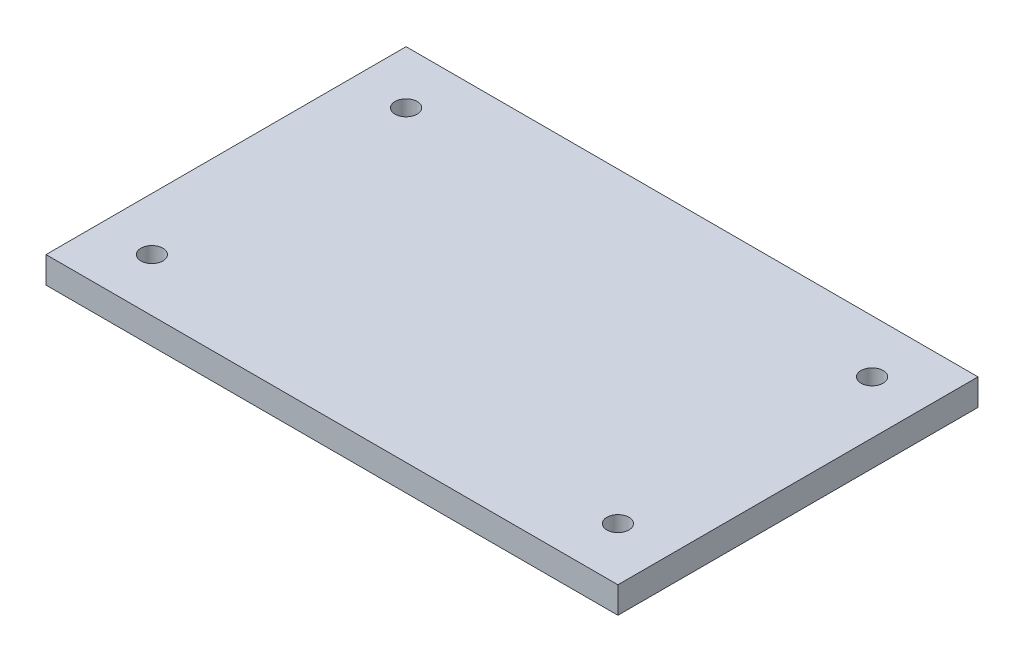
ISO-10303-21;
HEADER;
FILE_DESCRIPTION(('STEP AP214'),'2;1');
FILE_NAME('part.step','',(''),(''),'','','');
FILE_SCHEMA(('AUTOMOTIVE_DESIGN { 1 0 10303 214 1 1 1 1 }'));
ENDSEC;
DATA;
#1=APPLICATION_CONTEXT('core data for automotive mechanical design processes');
#2=APPLICATION_PROTOCOL_DEFINITION('international standard','automotive_design',2000,#1);
#3=PRODUCT_CONTEXT('',#1,'mechanical');
#4=PRODUCT('Part','Part','',(#3));
#5=PRODUCT_RELATED_PRODUCT_CATEGORY('part','',(#4));
#6=PRODUCT_DEFINITION_FORMATION('','',#4);
#7=PRODUCT_DEFINITION_CONTEXT('part definition',#1,'design');
#8=PRODUCT_DEFINITION('design','',#6,#7);
#9=PRODUCT_DEFINITION_SHAPE('','',#8);
#10=(LENGTH_UNIT() NAMED_UNIT(*) SI_UNIT(.MILLI.,.METRE.));
#11=(NAMED_UNIT(*) PLANE_ANGLE_UNIT() SI_UNIT($,.RADIAN.));
#12=(NAMED_UNIT(*) SI_UNIT($,.STERADIAN.) SOLID_ANGLE_UNIT());
#13=UNCERTAINTY_MEASURE_WITH_UNIT(LENGTH_MEASURE(1.E-05),#10,'distance_accuracy_value','');
#14=(GEOMETRIC_REPRESENTATION_CONTEXT(3) GLOBAL_UNCERTAINTY_ASSIGNED_CONTEXT((#13)) GLOBAL_UNIT_ASSIGNED_CONTEXT((#10,
#11,#12)) REPRESENTATION_CONTEXT('',''));
#15=CARTESIAN_POINT('',(0.,0.,0.));
#16=DIRECTION('',(0.,0.,1.));
#17=DIRECTION('',(1.,0.,0.));
#18=AXIS2_PLACEMENT_3D('',#15,#16,#17);
#19=CARTESIAN_POINT('',(7.62,6.35,-7.62));
#20=DIRECTION('',(1.,0.,0.));
#21=DIRECTION('',(0.,0.,-1.));
#22=AXIS2_PLACEMENT_3D('',#19,#20,#21);
#23=PLANE('',#22);
#24=DIRECTION('',(0.,0.,1.));
#25=VECTOR('',#24,1.);
#26=CARTESIAN_POINT('',(7.62,0.,-7.62));
#27=LINE('',#26,#25);
#28=CARTESIAN_POINT('',(7.62,0.,-93.98));
#29=VERTEX_POINT('',#28);
#30=CARTESIAN_POINT('',(7.62,0.,-7.62));
#31=VERTEX_POINT('',#30);
#32=EDGE_CURVE('E96',#29,#31,#27,.T.);
#33=ORIENTED_EDGE('',*,*,#32,.T.);
#34=DIRECTION('',(0.,-1.,0.));
#35=VECTOR('',#34,1.);
#36=CARTESIAN_POINT('',(7.62,6.35,-7.62));
#37=LINE('',#36,#35);
#38=CARTESIAN_POINT('',(7.62,6.35,-7.62));
#39=VERTEX_POINT('',#38);
#40=EDGE_CURVE('E11',#39,#31,#37,.T.);
#41=ORIENTED_EDGE('',*,*,#40,.F.);
#42=DIRECTION('',(0.,0.,1.));
#43=VECTOR('',#42,1.);
#44=CARTESIAN_POINT('',(7.62,6.35,-7.62));
#45=LINE('',#44,#43);
#46=CARTESIAN_POINT('',(7.62,6.35,-93.98));
#47=VERTEX_POINT('',#46);
#48=EDGE_CURVE('E84',#47,#39,#45,.T.);
#49=ORIENTED_EDGE('',*,*,#48,.F.);
#50=DIRECTION('',(0.,-1.,0.));
#51=VECTOR('',#50,1.);
#52=CARTESIAN_POINT('',(7.62,6.35,-93.98));
#53=LINE('',#52,#51);
#54=EDGE_CURVE('E92',#47,#29,#53,.T.);
#55=ORIENTED_EDGE('',*,*,#54,.T.);
#56=EDGE_LOOP('',(#33,#41,#49,#55));
#57=FACE_BOUND('',#56,.T.);
#58=ADVANCED_FACE('F33',(#57),#23,.F.);
#59=CARTESIAN_POINT('',(7.62,6.35,-7.62));
#60=DIRECTION('',(0.,0.,-1.));
#61=DIRECTION('',(-1.,0.,0.));
#62=AXIS2_PLACEMENT_3D('',#59,#60,#61);
#63=PLANE('',#62);
#64=DIRECTION('',(1.,0.,0.));
#65=VECTOR('',#64,1.);
#66=CARTESIAN_POINT('',(7.62,0.,-7.62));
#67=LINE('',#66,#65);
#68=CARTESIAN_POINT('',(144.78,0.,-7.62));
#69=VERTEX_POINT('',#68);
#70=EDGE_CURVE('E88',#31,#69,#67,.T.);
#71=ORIENTED_EDGE('',*,*,#70,.T.);
#72=DIRECTION('',(0.,-1.,0.));
#73=VECTOR('',#72,1.);
#74=CARTESIAN_POINT('',(144.78,6.35,-7.62));
#75=LINE('',#74,#73);
#76=CARTESIAN_POINT('',(144.78,6.35,-7.62));
#77=VERTEX_POINT('',#76);
#78=EDGE_CURVE('E41',#77,#69,#75,.T.);
#79=ORIENTED_EDGE('',*,*,#78,.F.);
#80=DIRECTION('',(1.,0.,0.));
#81=VECTOR('',#80,1.);
#82=CARTESIAN_POINT('',(7.62,6.35,-7.62));
#83=LINE('',#82,#81);
#84=EDGE_CURVE('E79',#39,#77,#83,.T.);
#85=ORIENTED_EDGE('',*,*,#84,.F.);
#86=ORIENTED_EDGE('',*,*,#40,.T.);
#87=EDGE_LOOP('',(#71,#79,#85,#86));
#88=FACE_BOUND('',#87,.T.);
#89=ADVANCED_FACE('F87',(#88),#63,.F.);
#90=CARTESIAN_POINT('',(144.78,6.35,-7.62));
#91=DIRECTION('',(-1.,0.,0.));
#92=DIRECTION('',(0.,0.,1.));
#93=AXIS2_PLACEMENT_3D('',#90,#91,#92);
#94=PLANE('',#93);
#95=DIRECTION('',(0.,0.,-1.));
#96=VECTOR('',#95,1.);
#97=CARTESIAN_POINT('',(144.78,0.,-7.62));
#98=LINE('',#97,#96);
#99=CARTESIAN_POINT('',(144.78,0.,-93.98));
#100=VERTEX_POINT('',#99);
#101=EDGE_CURVE('E66',#69,#100,#98,.T.);
#102=ORIENTED_EDGE('',*,*,#101,.T.);
#103=DIRECTION('',(0.,-1.,0.));
#104=VECTOR('',#103,1.);
#105=CARTESIAN_POINT('',(144.78,6.35,-93.98));
#106=LINE('',#105,#104);
#107=CARTESIAN_POINT('',(144.78,6.35,-93.98));
#108=VERTEX_POINT('',#107);
#109=EDGE_CURVE('E89',#108,#100,#106,.T.);
#110=ORIENTED_EDGE('',*,*,#109,.F.);
#111=DIRECTION('',(0.,0.,-1.));
#112=VECTOR('',#111,1.);
#113=CARTESIAN_POINT('',(144.78,6.35,-7.62));
#114=LINE('',#113,#112);
#115=EDGE_CURVE('E82',#77,#108,#114,.T.);
#116=ORIENTED_EDGE('',*,*,#115,.F.);
#117=ORIENTED_EDGE('',*,*,#78,.T.);
#118=EDGE_LOOP('',(#102,#110,#116,#117));
#119=FACE_BOUND('',#118,.T.);
#120=ADVANCED_FACE('F90',(#119),#94,.F.);
#121=CARTESIAN_POINT('',(7.62,6.35,-93.98));
#122=DIRECTION('',(0.,0.,1.));
#123=DIRECTION('',(1.,0.,0.));
#124=AXIS2_PLACEMENT_3D('',#121,#122,#123);
#125=PLANE('',#124);
#126=DIRECTION('',(-1.,0.,0.));
#127=VECTOR('',#126,1.);
#128=CARTESIAN_POINT('',(7.62,0.,-93.98));
#129=LINE('',#128,#127);
#130=EDGE_CURVE('E72',#100,#29,#129,.T.);
#131=ORIENTED_EDGE('',*,*,#130,.T.);
#132=ORIENTED_EDGE('',*,*,#54,.F.);
#133=DIRECTION('',(-1.,0.,0.));
#134=VECTOR('',#133,1.);
#135=CARTESIAN_POINT('',(7.62,6.35,-93.98));
#136=LINE('',#135,#134);
#137=EDGE_CURVE('E49',#108,#47,#136,.T.);
#138=ORIENTED_EDGE('',*,*,#137,.F.);
#139=ORIENTED_EDGE('',*,*,#109,.T.);
#140=EDGE_LOOP('',(#131,#132,#138,#139));
#141=FACE_BOUND('',#140,.T.);
#142=ADVANCED_FACE('F104',(#141),#125,.F.);
#143=CARTESIAN_POINT('',(0.,6.35,0.));
#144=DIRECTION('',(0.,-1.,0.));
#145=DIRECTION('',(0.,0.,-1.));
#146=AXIS2_PLACEMENT_3D('',#143,#144,#145);
#147=PLANE('',#146);
#148=CARTESIAN_POINT('',(20.32,6.35,-81.28));
#149=DIRECTION('',(0.,1.,0.));
#150=DIRECTION('',(0.,0.,1.));
#151=AXIS2_PLACEMENT_3D('',#148,#149,#150);
#152=CIRCLE('',#151,2.65);
#153=CARTESIAN_POINT('',(20.32,6.35,-78.63));
#154=VERTEX_POINT('',#153);
#155=EDGE_CURVE('E130',#154,#154,#152,.T.);
#156=ORIENTED_EDGE('',*,*,#155,.F.);
#157=EDGE_LOOP('',(#156));
#158=FACE_BOUND('',#157,.T.);
#159=CARTESIAN_POINT('',(132.08,6.35,-81.28));
#160=DIRECTION('',(0.,1.,0.));
#161=DIRECTION('',(0.,0.,1.));
#162=AXIS2_PLACEMENT_3D('',#159,#160,#161);
#163=CIRCLE('',#162,2.64999999999999);
#164=CARTESIAN_POINT('',(132.08,6.35,-78.63));
#165=VERTEX_POINT('',#164);
#166=EDGE_CURVE('E124',#165,#165,#163,.T.);
#167=ORIENTED_EDGE('',*,*,#166,.F.);
#168=EDGE_LOOP('',(#167));
#169=FACE_BOUND('',#168,.T.);
#170=CARTESIAN_POINT('',(132.08,6.35,-20.32));
#171=DIRECTION('',(0.,1.,0.));
#172=DIRECTION('',(0.,0.,1.));
#173=AXIS2_PLACEMENT_3D('',#170,#171,#172);
#174=CIRCLE('',#173,2.64999999999999);
#175=CARTESIAN_POINT('',(132.08,6.35,-17.67));
#176=VERTEX_POINT('',#175);
#177=EDGE_CURVE('E118',#176,#176,#174,.T.);
#178=ORIENTED_EDGE('',*,*,#177,.F.);
#179=EDGE_LOOP('',(#178));
#180=FACE_BOUND('',#179,.T.);
#181=CARTESIAN_POINT('',(20.32,6.35,-20.32));
#182=DIRECTION('',(0.,1.,0.));
#183=DIRECTION('',(0.,0.,1.));
#184=AXIS2_PLACEMENT_3D('',#181,#182,#183);
#185=CIRCLE('',#184,2.65);
#186=CARTESIAN_POINT('',(20.32,6.35,-17.67));
#187=VERTEX_POINT('',#186);
#188=EDGE_CURVE('E112',#187,#187,#185,.T.);
#189=ORIENTED_EDGE('',*,*,#188,.F.);
#190=EDGE_LOOP('',(#189));
#191=FACE_BOUND('',#190,.T.);
#192=ORIENTED_EDGE('',*,*,#48,.T.);
#193=ORIENTED_EDGE('',*,*,#84,.T.);
#194=ORIENTED_EDGE('',*,*,#115,.T.);
#195=ORIENTED_EDGE('',*,*,#137,.T.);
#196=EDGE_LOOP('',(#192,#193,#194,#195));
#197=FACE_BOUND('',#196,.T.);
#198=ADVANCED_FACE('F80',(#158,#169,#180,#191,#197),#147,.F.);
#199=CARTESIAN_POINT('',(0.,0.,0.));
#200=DIRECTION('',(0.,-1.,0.));
#201=DIRECTION('',(0.,0.,-1.));
#202=AXIS2_PLACEMENT_3D('',#199,#200,#201);
#203=PLANE('',#202);
#204=CARTESIAN_POINT('',(20.32,0.,-81.28));
#205=DIRECTION('',(0.,1.,0.));
#206=DIRECTION('',(0.,0.,1.));
#207=AXIS2_PLACEMENT_3D('',#204,#205,#206);
#208=CIRCLE('',#207,2.65);
#209=CARTESIAN_POINT('',(20.32,0.,-78.63));
#210=VERTEX_POINT('',#209);
#211=EDGE_CURVE('E127',#210,#210,#208,.T.);
#212=ORIENTED_EDGE('',*,*,#211,.T.);
#213=EDGE_LOOP('',(#212));
#214=FACE_BOUND('',#213,.T.);
#215=CARTESIAN_POINT('',(132.08,0.,-81.28));
#216=DIRECTION('',(0.,1.,0.));
#217=DIRECTION('',(0.,0.,1.));
#218=AXIS2_PLACEMENT_3D('',#215,#216,#217);
#219=CIRCLE('',#218,2.64999999999999);
#220=CARTESIAN_POINT('',(132.08,0.,-78.63));
#221=VERTEX_POINT('',#220);
#222=EDGE_CURVE('E121',#221,#221,#219,.T.);
#223=ORIENTED_EDGE('',*,*,#222,.T.);
#224=EDGE_LOOP('',(#223));
#225=FACE_BOUND('',#224,.T.);
#226=CARTESIAN_POINT('',(132.08,0.,-20.32));
#227=DIRECTION('',(0.,1.,0.));
#228=DIRECTION('',(0.,0.,1.));
#229=AXIS2_PLACEMENT_3D('',#226,#227,#228);
#230=CIRCLE('',#229,2.64999999999999);
#231=CARTESIAN_POINT('',(132.08,0.,-17.67));
#232=VERTEX_POINT('',#231);
#233=EDGE_CURVE('E115',#232,#232,#230,.T.);
#234=ORIENTED_EDGE('',*,*,#233,.T.);
#235=EDGE_LOOP('',(#234));
#236=FACE_BOUND('',#235,.T.);
#237=CARTESIAN_POINT('',(20.32,0.,-20.32));
#238=DIRECTION('',(0.,1.,0.));
#239=DIRECTION('',(0.,0.,1.));
#240=AXIS2_PLACEMENT_3D('',#237,#238,#239);
#241=CIRCLE('',#240,2.65);
#242=CARTESIAN_POINT('',(20.32,0.,-17.67));
#243=VERTEX_POINT('',#242);
#244=EDGE_CURVE('E99',#243,#243,#241,.T.);
#245=ORIENTED_EDGE('',*,*,#244,.T.);
#246=EDGE_LOOP('',(#245));
#247=FACE_BOUND('',#246,.T.);
#248=ORIENTED_EDGE('',*,*,#32,.F.);
#249=ORIENTED_EDGE('',*,*,#130,.F.);
#250=ORIENTED_EDGE('',*,*,#101,.F.);
#251=ORIENTED_EDGE('',*,*,#70,.F.);
#252=EDGE_LOOP('',(#248,#249,#250,#251));
#253=FACE_BOUND('',#252,.T.);
#254=ADVANCED_FACE('F107',(#214,#225,#236,#247,#253),#203,.T.);
#255=CARTESIAN_POINT('',(20.32,6.35,-20.32));
#256=DIRECTION('',(0.,1.,0.));
#257=DIRECTION('',(0.,0.,1.));
#258=AXIS2_PLACEMENT_3D('',#255,#256,#257);
#259=CYLINDRICAL_SURFACE('',#258,2.65);
#260=ORIENTED_EDGE('',*,*,#244,.F.);
#261=EDGE_LOOP('',(#260));
#262=FACE_BOUND('',#261,.T.);
#263=ORIENTED_EDGE('',*,*,#188,.T.);
#264=EDGE_LOOP('',(#263));
#265=FACE_BOUND('',#264,.T.);
#266=ADVANCED_FACE('F145',(#262,#265),#259,.F.);
#267=CARTESIAN_POINT('',(132.08,6.35,-20.32));
#268=DIRECTION('',(0.,1.,0.));
#269=DIRECTION('',(0.,0.,1.));
#270=AXIS2_PLACEMENT_3D('',#267,#268,#269);
#271=CYLINDRICAL_SURFACE('',#270,2.64999999999999);
#272=ORIENTED_EDGE('',*,*,#233,.F.);
#273=EDGE_LOOP('',(#272));
#274=FACE_BOUND('',#273,.T.);
#275=ORIENTED_EDGE('',*,*,#177,.T.);
#276=EDGE_LOOP('',(#275));
#277=FACE_BOUND('',#276,.T.);
#278=ADVANCED_FACE('F147',(#274,#277),#271,.F.);
#279=CARTESIAN_POINT('',(132.08,6.35,-81.28));
#280=DIRECTION('',(0.,1.,0.));
#281=DIRECTION('',(0.,0.,1.));
#282=AXIS2_PLACEMENT_3D('',#279,#280,#281);
#283=CYLINDRICAL_SURFACE('',#282,2.64999999999999);
#284=ORIENTED_EDGE('',*,*,#222,.F.);
#285=EDGE_LOOP('',(#284));
#286=FACE_BOUND('',#285,.T.);
#287=ORIENTED_EDGE('',*,*,#166,.T.);
#288=EDGE_LOOP('',(#287));
#289=FACE_BOUND('',#288,.T.);
#290=ADVANCED_FACE('F154',(#286,#289),#283,.F.);
#291=CARTESIAN_POINT('',(20.32,6.35,-81.28));
#292=DIRECTION('',(0.,1.,0.));
#293=DIRECTION('',(0.,0.,1.));
#294=AXIS2_PLACEMENT_3D('',#291,#292,#293);
#295=CYLINDRICAL_SURFACE('',#294,2.65);
#296=ORIENTED_EDGE('',*,*,#211,.F.);
#297=EDGE_LOOP('',(#296));
#298=FACE_BOUND('',#297,.T.);
#299=ORIENTED_EDGE('',*,*,#155,.T.);
#300=EDGE_LOOP('',(#299));
#301=FACE_BOUND('',#300,.T.);
#302=ADVANCED_FACE('F134',(#298,#301),#295,.F.);
#303=CLOSED_SHELL('',(#58,#89,#120,#142,#198,#254,#266,#278,#290,#302));
#304=MANIFOLD_SOLID_BREP('B2',#303);
#305=ADVANCED_BREP_SHAPE_REPRESENTATION('',(#18,#304),#14);
#306=SHAPE_DEFINITION_REPRESENTATION(#9,#305);
ENDSEC;
END-ISO-10303-21;
